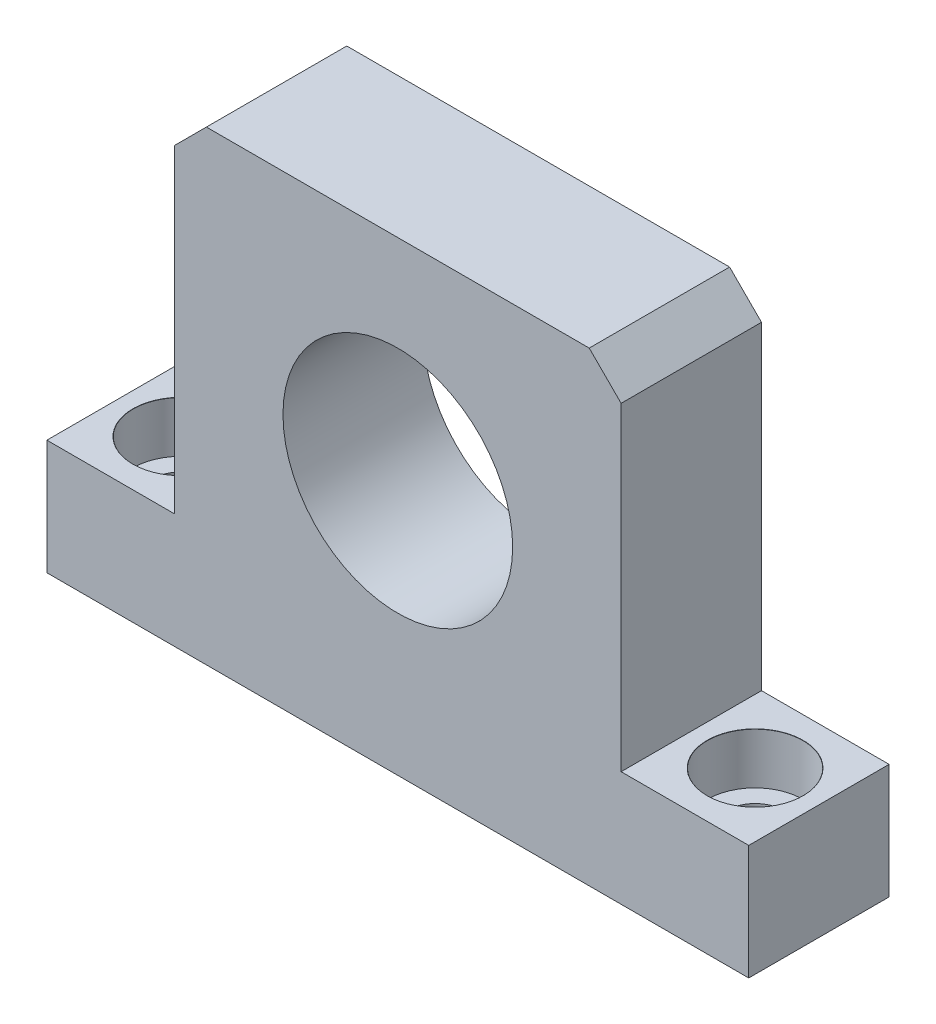
ISO-10303-21;
HEADER;
FILE_DESCRIPTION(('STEP AP214'),'2;1');
FILE_NAME('part.step','',(''),(''),'','','');
FILE_SCHEMA(('AUTOMOTIVE_DESIGN { 1 0 10303 214 1 1 1 1 }'));
ENDSEC;
DATA;
#1=APPLICATION_CONTEXT('core data for automotive mechanical design processes');
#2=APPLICATION_PROTOCOL_DEFINITION('international standard','automotive_design',2000,#1);
#3=PRODUCT_CONTEXT('',#1,'mechanical');
#4=PRODUCT('Part','Part','',(#3));
#5=PRODUCT_RELATED_PRODUCT_CATEGORY('part','',(#4));
#6=PRODUCT_DEFINITION_FORMATION('','',#4);
#7=PRODUCT_DEFINITION_CONTEXT('part definition',#1,'design');
#8=PRODUCT_DEFINITION('design','',#6,#7);
#9=PRODUCT_DEFINITION_SHAPE('','',#8);
#10=(LENGTH_UNIT() NAMED_UNIT(*) SI_UNIT(.MILLI.,.METRE.));
#11=(NAMED_UNIT(*) PLANE_ANGLE_UNIT() SI_UNIT($,.RADIAN.));
#12=(NAMED_UNIT(*) SI_UNIT($,.STERADIAN.) SOLID_ANGLE_UNIT());
#13=UNCERTAINTY_MEASURE_WITH_UNIT(LENGTH_MEASURE(1.E-05),#10,'distance_accuracy_value','');
#14=(GEOMETRIC_REPRESENTATION_CONTEXT(3) GLOBAL_UNCERTAINTY_ASSIGNED_CONTEXT((#13)) GLOBAL_UNIT_ASSIGNED_CONTEXT((#10,
#11,#12)) REPRESENTATION_CONTEXT('',''));
#15=CARTESIAN_POINT('',(0.,0.,0.));
#16=DIRECTION('',(0.,0.,1.));
#17=DIRECTION('',(1.,0.,0.));
#18=AXIS2_PLACEMENT_3D('',#15,#16,#17);
#19=CARTESIAN_POINT('',(-55.,18.,11.));
#20=DIRECTION('',(0.,0.,-1.));
#21=DIRECTION('',(-1.,0.,0.));
#22=AXIS2_PLACEMENT_3D('',#19,#20,#21);
#23=PLANE('',#22);
#24=DIRECTION('',(0.,-1.,0.));
#25=VECTOR('',#24,1.);
#26=CARTESIAN_POINT('',(-55.,0.,11.));
#27=LINE('',#26,#25);
#28=CARTESIAN_POINT('',(-55.,18.,11.));
#29=VERTEX_POINT('',#28);
#30=CARTESIAN_POINT('',(-55.,0.,11.));
#31=VERTEX_POINT('',#30);
#32=EDGE_CURVE('E167',#29,#31,#27,.T.);
#33=ORIENTED_EDGE('',*,*,#32,.T.);
#34=DIRECTION('',(1.,0.,0.));
#35=VECTOR('',#34,1.);
#36=CARTESIAN_POINT('',(-55.,0.,11.));
#37=LINE('',#36,#35);
#38=CARTESIAN_POINT('',(55.,0.,11.));
#39=VERTEX_POINT('',#38);
#40=EDGE_CURVE('E103',#31,#39,#37,.T.);
#41=ORIENTED_EDGE('',*,*,#40,.T.);
#42=DIRECTION('',(0.,1.,0.));
#43=VECTOR('',#42,1.);
#44=CARTESIAN_POINT('',(55.,0.,11.));
#45=LINE('',#44,#43);
#46=CARTESIAN_POINT('',(55.,18.,11.));
#47=VERTEX_POINT('',#46);
#48=EDGE_CURVE('E188',#39,#47,#45,.T.);
#49=ORIENTED_EDGE('',*,*,#48,.T.);
#50=DIRECTION('',(-1.,0.,0.));
#51=VECTOR('',#50,1.);
#52=CARTESIAN_POINT('',(35.,18.,11.));
#53=LINE('',#52,#51);
#54=CARTESIAN_POINT('',(35.,18.,11.));
#55=VERTEX_POINT('',#54);
#56=EDGE_CURVE('E207',#47,#55,#53,.T.);
#57=ORIENTED_EDGE('',*,*,#56,.T.);
#58=DIRECTION('',(0.,1.,0.));
#59=VECTOR('',#58,1.);
#60=CARTESIAN_POINT('',(35.,18.,11.));
#61=LINE('',#60,#59);
#62=CARTESIAN_POINT('',(35.,68.,11.));
#63=VERTEX_POINT('',#62);
#64=EDGE_CURVE('E204',#55,#63,#61,.T.);
#65=ORIENTED_EDGE('',*,*,#64,.T.);
#66=DIRECTION('',(-0.707106781186546,0.707106781186549,0.));
#67=VECTOR('',#66,1.);
#68=CARTESIAN_POINT('',(30.,73.,11.));
#69=LINE('',#68,#67);
#70=CARTESIAN_POINT('',(30.,73.,11.));
#71=VERTEX_POINT('',#70);
#72=EDGE_CURVE('E206',#63,#71,#69,.T.);
#73=ORIENTED_EDGE('',*,*,#72,.T.);
#74=DIRECTION('',(-1.,0.,0.));
#75=VECTOR('',#74,1.);
#76=CARTESIAN_POINT('',(-30.,73.,11.));
#77=LINE('',#76,#75);
#78=CARTESIAN_POINT('',(-30.,73.,11.));
#79=VERTEX_POINT('',#78);
#80=EDGE_CURVE('E130',#71,#79,#77,.T.);
#81=ORIENTED_EDGE('',*,*,#80,.T.);
#82=DIRECTION('',(-0.707106781186547,-0.707106781186548,0.));
#83=VECTOR('',#82,1.);
#84=CARTESIAN_POINT('',(-35.,68.,11.));
#85=LINE('',#84,#83);
#86=CARTESIAN_POINT('',(-35.,68.,11.));
#87=VERTEX_POINT('',#86);
#88=EDGE_CURVE('E124',#79,#87,#85,.T.);
#89=ORIENTED_EDGE('',*,*,#88,.T.);
#90=DIRECTION('',(0.,-1.,0.));
#91=VECTOR('',#90,1.);
#92=CARTESIAN_POINT('',(-35.,18.,11.));
#93=LINE('',#92,#91);
#94=CARTESIAN_POINT('',(-35.,18.,11.));
#95=VERTEX_POINT('',#94);
#96=EDGE_CURVE('E128',#87,#95,#93,.T.);
#97=ORIENTED_EDGE('',*,*,#96,.T.);
#98=DIRECTION('',(-1.,0.,0.));
#99=VECTOR('',#98,1.);
#100=CARTESIAN_POINT('',(-55.,18.,11.));
#101=LINE('',#100,#99);
#102=EDGE_CURVE('E53',#95,#29,#101,.T.);
#103=ORIENTED_EDGE('',*,*,#102,.T.);
#104=EDGE_LOOP('',(#33,#41,#49,#57,#65,#73,#81,#89,#97,#103));
#105=FACE_BOUND('',#104,.T.);
#106=CARTESIAN_POINT('',(0.,40.,11.));
#107=DIRECTION('',(0.,0.,1.));
#108=DIRECTION('',(1.,0.,0.));
#109=AXIS2_PLACEMENT_3D('',#106,#107,#108);
#110=CIRCLE('',#109,18.);
#111=CARTESIAN_POINT('',(18.,40.,11.));
#112=VERTEX_POINT('',#111);
#113=EDGE_CURVE('E152',#112,#112,#110,.T.);
#114=ORIENTED_EDGE('',*,*,#113,.F.);
#115=EDGE_LOOP('',(#114));
#116=FACE_BOUND('',#115,.T.);
#117=ADVANCED_FACE('F36',(#105,#116),#23,.F.);
#118=CARTESIAN_POINT('',(-55.,18.,-11.));
#119=DIRECTION('',(0.,0.,-1.));
#120=DIRECTION('',(-1.,0.,0.));
#121=AXIS2_PLACEMENT_3D('',#118,#119,#120);
#122=PLANE('',#121);
#123=CARTESIAN_POINT('',(-16.6159006878512,25.3829906421212,-11.));
#124=DIRECTION('',(0.,0.,-1.));
#125=DIRECTION('',(-1.,0.,0.));
#126=AXIS2_PLACEMENT_3D('',#123,#124,#125);
#127=CIRCLE('',#126,2.49999999999999);
#128=CARTESIAN_POINT('',(-19.1159006878512,25.3829906421212,-11.));
#129=VERTEX_POINT('',#128);
#130=EDGE_CURVE('E283',#129,#129,#127,.T.);
#131=ORIENTED_EDGE('',*,*,#130,.F.);
#132=EDGE_LOOP('',(#131));
#133=FACE_BOUND('',#132,.T.);
#134=CARTESIAN_POINT('',(16.6181180279163,25.3829906421212,-11.));
#135=DIRECTION('',(0.,0.,-1.));
#136=DIRECTION('',(-1.,0.,0.));
#137=AXIS2_PLACEMENT_3D('',#134,#135,#136);
#138=CIRCLE('',#137,2.49999999999999);
#139=CARTESIAN_POINT('',(14.1181180279163,25.3829906421212,-11.));
#140=VERTEX_POINT('',#139);
#141=EDGE_CURVE('E277',#140,#140,#138,.T.);
#142=ORIENTED_EDGE('',*,*,#141,.F.);
#143=EDGE_LOOP('',(#142));
#144=FACE_BOUND('',#143,.T.);
#145=CARTESIAN_POINT('',(23.5011086700326,42.0000000000052,-11.));
#146=DIRECTION('',(0.,0.,-1.));
#147=DIRECTION('',(-1.,0.,0.));
#148=AXIS2_PLACEMENT_3D('',#145,#146,#147);
#149=CIRCLE('',#148,2.49999999999999);
#150=CARTESIAN_POINT('',(21.0011086700326,42.0000000000052,-11.));
#151=VERTEX_POINT('',#150);
#152=EDGE_CURVE('E271',#151,#151,#149,.T.);
#153=ORIENTED_EDGE('',*,*,#152,.F.);
#154=EDGE_LOOP('',(#153));
#155=FACE_BOUND('',#154,.T.);
#156=CARTESIAN_POINT('',(16.6181180279165,58.617009357889,-11.));
#157=DIRECTION('',(0.,0.,-1.));
#158=DIRECTION('',(-1.,0.,0.));
#159=AXIS2_PLACEMENT_3D('',#156,#157,#158);
#160=CIRCLE('',#159,2.49999999999999);
#161=CARTESIAN_POINT('',(14.1181180279165,58.617009357889,-11.));
#162=VERTEX_POINT('',#161);
#163=EDGE_CURVE('E265',#162,#162,#160,.T.);
#164=ORIENTED_EDGE('',*,*,#163,.F.);
#165=EDGE_LOOP('',(#164));
#166=FACE_BOUND('',#165,.T.);
#167=CARTESIAN_POINT('',(-16.6159006878514,58.617009357889,-11.));
#168=DIRECTION('',(0.,0.,-1.));
#169=DIRECTION('',(-1.,0.,0.));
#170=AXIS2_PLACEMENT_3D('',#167,#168,#169);
#171=CIRCLE('',#170,2.49999999999999);
#172=CARTESIAN_POINT('',(-19.1159006878513,58.617009357889,-11.));
#173=VERTEX_POINT('',#172);
#174=EDGE_CURVE('E259',#173,#173,#171,.T.);
#175=ORIENTED_EDGE('',*,*,#174,.F.);
#176=EDGE_LOOP('',(#175));
#177=FACE_BOUND('',#176,.T.);
#178=CARTESIAN_POINT('',(-23.4988913299675,42.0000000000052,-11.));
#179=DIRECTION('',(0.,0.,-1.));
#180=DIRECTION('',(-1.,0.,0.));
#181=AXIS2_PLACEMENT_3D('',#178,#179,#180);
#182=CIRCLE('',#181,2.49999999999999);
#183=CARTESIAN_POINT('',(-25.9988913299674,42.0000000000052,-11.));
#184=VERTEX_POINT('',#183);
#185=EDGE_CURVE('E253',#184,#184,#182,.T.);
#186=ORIENTED_EDGE('',*,*,#185,.F.);
#187=EDGE_LOOP('',(#186));
#188=FACE_BOUND('',#187,.T.);
#189=DIRECTION('',(0.,-1.,0.));
#190=VECTOR('',#189,1.);
#191=CARTESIAN_POINT('',(-55.,0.,-11.));
#192=LINE('',#191,#190);
#193=CARTESIAN_POINT('',(-55.,18.,-11.));
#194=VERTEX_POINT('',#193);
#195=CARTESIAN_POINT('',(-55.,0.,-11.));
#196=VERTEX_POINT('',#195);
#197=EDGE_CURVE('E148',#194,#196,#192,.T.);
#198=ORIENTED_EDGE('',*,*,#197,.F.);
#199=DIRECTION('',(-1.,0.,0.));
#200=VECTOR('',#199,1.);
#201=CARTESIAN_POINT('',(-55.,18.,-11.));
#202=LINE('',#201,#200);
#203=CARTESIAN_POINT('',(-35.,18.,-11.));
#204=VERTEX_POINT('',#203);
#205=EDGE_CURVE('E95',#204,#194,#202,.T.);
#206=ORIENTED_EDGE('',*,*,#205,.F.);
#207=DIRECTION('',(0.,-1.,0.));
#208=VECTOR('',#207,1.);
#209=CARTESIAN_POINT('',(-35.,18.,-11.));
#210=LINE('',#209,#208);
#211=CARTESIAN_POINT('',(-35.,68.,-11.));
#212=VERTEX_POINT('',#211);
#213=EDGE_CURVE('E89',#212,#204,#210,.T.);
#214=ORIENTED_EDGE('',*,*,#213,.F.);
#215=DIRECTION('',(-0.707106781186547,-0.707106781186548,0.));
#216=VECTOR('',#215,1.);
#217=CARTESIAN_POINT('',(-35.,68.,-11.));
#218=LINE('',#217,#216);
#219=CARTESIAN_POINT('',(-30.,73.,-11.));
#220=VERTEX_POINT('',#219);
#221=EDGE_CURVE('E138',#220,#212,#218,.T.);
#222=ORIENTED_EDGE('',*,*,#221,.F.);
#223=DIRECTION('',(-1.,0.,0.));
#224=VECTOR('',#223,1.);
#225=CARTESIAN_POINT('',(-30.,73.,-11.));
#226=LINE('',#225,#224);
#227=CARTESIAN_POINT('',(30.,73.,-11.));
#228=VERTEX_POINT('',#227);
#229=EDGE_CURVE('E162',#228,#220,#226,.T.);
#230=ORIENTED_EDGE('',*,*,#229,.F.);
#231=DIRECTION('',(-0.707106781186546,0.707106781186549,0.));
#232=VECTOR('',#231,1.);
#233=CARTESIAN_POINT('',(30.,73.,-11.));
#234=LINE('',#233,#232);
#235=CARTESIAN_POINT('',(35.,68.,-11.));
#236=VERTEX_POINT('',#235);
#237=EDGE_CURVE('E160',#236,#228,#234,.T.);
#238=ORIENTED_EDGE('',*,*,#237,.F.);
#239=DIRECTION('',(0.,1.,0.));
#240=VECTOR('',#239,1.);
#241=CARTESIAN_POINT('',(35.,18.,-11.));
#242=LINE('',#241,#240);
#243=CARTESIAN_POINT('',(35.,18.,-11.));
#244=VERTEX_POINT('',#243);
#245=EDGE_CURVE('E158',#244,#236,#242,.T.);
#246=ORIENTED_EDGE('',*,*,#245,.F.);
#247=DIRECTION('',(-1.,0.,0.));
#248=VECTOR('',#247,1.);
#249=CARTESIAN_POINT('',(35.,18.,-11.));
#250=LINE('',#249,#248);
#251=CARTESIAN_POINT('',(55.,18.,-11.));
#252=VERTEX_POINT('',#251);
#253=EDGE_CURVE('E156',#252,#244,#250,.T.);
#254=ORIENTED_EDGE('',*,*,#253,.F.);
#255=DIRECTION('',(0.,1.,0.));
#256=VECTOR('',#255,1.);
#257=CARTESIAN_POINT('',(55.,0.,-11.));
#258=LINE('',#257,#256);
#259=CARTESIAN_POINT('',(55.,0.,-11.));
#260=VERTEX_POINT('',#259);
#261=EDGE_CURVE('E154',#260,#252,#258,.T.);
#262=ORIENTED_EDGE('',*,*,#261,.F.);
#263=DIRECTION('',(1.,0.,0.));
#264=VECTOR('',#263,1.);
#265=CARTESIAN_POINT('',(-55.,0.,-11.));
#266=LINE('',#265,#264);
#267=EDGE_CURVE('E151',#196,#260,#266,.T.);
#268=ORIENTED_EDGE('',*,*,#267,.F.);
#269=EDGE_LOOP('',(#198,#206,#214,#222,#230,#238,#246,#254,#262,#268));
#270=FACE_BOUND('',#269,.T.);
#271=CARTESIAN_POINT('',(0.,40.,-11.));
#272=DIRECTION('',(0.,0.,1.));
#273=DIRECTION('',(1.,0.,0.));
#274=AXIS2_PLACEMENT_3D('',#271,#272,#273);
#275=CIRCLE('',#274,18.);
#276=CARTESIAN_POINT('',(18.,40.,-11.));
#277=VERTEX_POINT('',#276);
#278=EDGE_CURVE('E215',#277,#277,#275,.T.);
#279=ORIENTED_EDGE('',*,*,#278,.T.);
#280=EDGE_LOOP('',(#279));
#281=FACE_BOUND('',#280,.T.);
#282=ADVANCED_FACE('F192',(#133,#144,#155,#166,#177,#188,#270,#281),#122,.T.);
#283=CARTESIAN_POINT('',(-55.,0.,11.));
#284=DIRECTION('',(1.,0.,0.));
#285=DIRECTION('',(0.,0.,-1.));
#286=AXIS2_PLACEMENT_3D('',#283,#284,#285);
#287=PLANE('',#286);
#288=ORIENTED_EDGE('',*,*,#197,.T.);
#289=DIRECTION('',(0.,0.,-1.));
#290=VECTOR('',#289,1.);
#291=CARTESIAN_POINT('',(-55.,0.,11.));
#292=LINE('',#291,#290);
#293=EDGE_CURVE('E11',#31,#196,#292,.T.);
#294=ORIENTED_EDGE('',*,*,#293,.F.);
#295=ORIENTED_EDGE('',*,*,#32,.F.);
#296=DIRECTION('',(0.,0.,-1.));
#297=VECTOR('',#296,1.);
#298=CARTESIAN_POINT('',(-55.,18.,11.));
#299=LINE('',#298,#297);
#300=EDGE_CURVE('E144',#29,#194,#299,.T.);
#301=ORIENTED_EDGE('',*,*,#300,.T.);
#302=EDGE_LOOP('',(#288,#294,#295,#301));
#303=FACE_BOUND('',#302,.T.);
#304=ADVANCED_FACE('F38',(#303),#287,.F.);
#305=CARTESIAN_POINT('',(-55.,0.,11.));
#306=DIRECTION('',(0.,1.,0.));
#307=DIRECTION('',(-1.,0.,0.));
#308=AXIS2_PLACEMENT_3D('',#305,#306,#307);
#309=PLANE('',#308);
#310=CARTESIAN_POINT('',(-45.,0.,0.));
#311=DIRECTION('',(0.,1.,0.));
#312=DIRECTION('',(0.,0.,1.));
#313=AXIS2_PLACEMENT_3D('',#310,#311,#312);
#314=CIRCLE('',#313,4.5);
#315=CARTESIAN_POINT('',(-45.,0.,4.5));
#316=VERTEX_POINT('',#315);
#317=EDGE_CURVE('E235',#316,#316,#314,.T.);
#318=ORIENTED_EDGE('',*,*,#317,.T.);
#319=EDGE_LOOP('',(#318));
#320=FACE_BOUND('',#319,.T.);
#321=CARTESIAN_POINT('',(45.,0.,0.));
#322=DIRECTION('',(0.,1.,0.));
#323=DIRECTION('',(0.,0.,1.));
#324=AXIS2_PLACEMENT_3D('',#321,#322,#323);
#325=CIRCLE('',#324,4.5);
#326=CARTESIAN_POINT('',(45.,0.,4.5));
#327=VERTEX_POINT('',#326);
#328=EDGE_CURVE('E218',#327,#327,#325,.T.);
#329=ORIENTED_EDGE('',*,*,#328,.T.);
#330=EDGE_LOOP('',(#329));
#331=FACE_BOUND('',#330,.T.);
#332=ORIENTED_EDGE('',*,*,#267,.T.);
#333=DIRECTION('',(0.,0.,-1.));
#334=VECTOR('',#333,1.);
#335=CARTESIAN_POINT('',(55.,0.,11.));
#336=LINE('',#335,#334);
#337=EDGE_CURVE('E45',#39,#260,#336,.T.);
#338=ORIENTED_EDGE('',*,*,#337,.F.);
#339=ORIENTED_EDGE('',*,*,#40,.F.);
#340=ORIENTED_EDGE('',*,*,#293,.T.);
#341=EDGE_LOOP('',(#332,#338,#339,#340));
#342=FACE_BOUND('',#341,.T.);
#343=ADVANCED_FACE('F349',(#320,#331,#342),#309,.F.);
#344=CARTESIAN_POINT('',(55.,0.,11.));
#345=DIRECTION('',(-1.,0.,0.));
#346=DIRECTION('',(0.,0.,1.));
#347=AXIS2_PLACEMENT_3D('',#344,#345,#346);
#348=PLANE('',#347);
#349=ORIENTED_EDGE('',*,*,#261,.T.);
#350=DIRECTION('',(0.,0.,-1.));
#351=VECTOR('',#350,1.);
#352=CARTESIAN_POINT('',(55.,18.,11.));
#353=LINE('',#352,#351);
#354=EDGE_CURVE('E180',#47,#252,#353,.T.);
#355=ORIENTED_EDGE('',*,*,#354,.F.);
#356=ORIENTED_EDGE('',*,*,#48,.F.);
#357=ORIENTED_EDGE('',*,*,#337,.T.);
#358=EDGE_LOOP('',(#349,#355,#356,#357));
#359=FACE_BOUND('',#358,.T.);
#360=ADVANCED_FACE('F186',(#359),#348,.F.);
#361=CARTESIAN_POINT('',(35.,18.,11.));
#362=DIRECTION('',(0.,-1.,0.));
#363=DIRECTION('',(1.,0.,0.));
#364=AXIS2_PLACEMENT_3D('',#361,#362,#363);
#365=PLANE('',#364);
#366=CARTESIAN_POINT('',(45.,18.,0.));
#367=DIRECTION('',(0.,1.,0.));
#368=DIRECTION('',(0.,0.,1.));
#369=AXIS2_PLACEMENT_3D('',#366,#367,#368);
#370=CIRCLE('',#369,7.525);
#371=CARTESIAN_POINT('',(45.,18.,7.52500000000001));
#372=VERTEX_POINT('',#371);
#373=EDGE_CURVE('E232',#372,#372,#370,.T.);
#374=ORIENTED_EDGE('',*,*,#373,.F.);
#375=EDGE_LOOP('',(#374));
#376=FACE_BOUND('',#375,.T.);
#377=ORIENTED_EDGE('',*,*,#253,.T.);
#378=DIRECTION('',(0.,0.,-1.));
#379=VECTOR('',#378,1.);
#380=CARTESIAN_POINT('',(35.,18.,11.));
#381=LINE('',#380,#379);
#382=EDGE_CURVE('E177',#55,#244,#381,.T.);
#383=ORIENTED_EDGE('',*,*,#382,.F.);
#384=ORIENTED_EDGE('',*,*,#56,.F.);
#385=ORIENTED_EDGE('',*,*,#354,.T.);
#386=EDGE_LOOP('',(#377,#383,#384,#385));
#387=FACE_BOUND('',#386,.T.);
#388=ADVANCED_FACE('F198',(#376,#387),#365,.F.);
#389=CARTESIAN_POINT('',(35.,18.,11.));
#390=DIRECTION('',(-1.,0.,0.));
#391=DIRECTION('',(0.,0.,1.));
#392=AXIS2_PLACEMENT_3D('',#389,#390,#391);
#393=PLANE('',#392);
#394=ORIENTED_EDGE('',*,*,#245,.T.);
#395=DIRECTION('',(0.,0.,-1.));
#396=VECTOR('',#395,1.);
#397=CARTESIAN_POINT('',(35.,68.,11.));
#398=LINE('',#397,#396);
#399=EDGE_CURVE('E174',#63,#236,#398,.T.);
#400=ORIENTED_EDGE('',*,*,#399,.F.);
#401=ORIENTED_EDGE('',*,*,#64,.F.);
#402=ORIENTED_EDGE('',*,*,#382,.T.);
#403=EDGE_LOOP('',(#394,#400,#401,#402));
#404=FACE_BOUND('',#403,.T.);
#405=ADVANCED_FACE('F202',(#404),#393,.F.);
#406=CARTESIAN_POINT('',(30.,73.,11.));
#407=DIRECTION('',(-0.707106781186549,-0.707106781186546,0.));
#408=DIRECTION('',(0.707106781186546,-0.707106781186549,0.));
#409=AXIS2_PLACEMENT_3D('',#406,#407,#408);
#410=PLANE('',#409);
#411=ORIENTED_EDGE('',*,*,#237,.T.);
#412=DIRECTION('',(0.,0.,-1.));
#413=VECTOR('',#412,1.);
#414=CARTESIAN_POINT('',(30.,73.,11.));
#415=LINE('',#414,#413);
#416=EDGE_CURVE('E171',#71,#228,#415,.T.);
#417=ORIENTED_EDGE('',*,*,#416,.F.);
#418=ORIENTED_EDGE('',*,*,#72,.F.);
#419=ORIENTED_EDGE('',*,*,#399,.T.);
#420=EDGE_LOOP('',(#411,#417,#418,#419));
#421=FACE_BOUND('',#420,.T.);
#422=ADVANCED_FACE('F338',(#421),#410,.F.);
#423=CARTESIAN_POINT('',(-30.,73.,11.));
#424=DIRECTION('',(0.,-1.,0.));
#425=DIRECTION('',(1.,0.,0.));
#426=AXIS2_PLACEMENT_3D('',#423,#424,#425);
#427=PLANE('',#426);
#428=ORIENTED_EDGE('',*,*,#229,.T.);
#429=DIRECTION('',(0.,0.,-1.));
#430=VECTOR('',#429,1.);
#431=CARTESIAN_POINT('',(-30.,73.,11.));
#432=LINE('',#431,#430);
#433=EDGE_CURVE('E139',#79,#220,#432,.T.);
#434=ORIENTED_EDGE('',*,*,#433,.F.);
#435=ORIENTED_EDGE('',*,*,#80,.F.);
#436=ORIENTED_EDGE('',*,*,#416,.T.);
#437=EDGE_LOOP('',(#428,#434,#435,#436));
#438=FACE_BOUND('',#437,.T.);
#439=ADVANCED_FACE('F335',(#438),#427,.F.);
#440=CARTESIAN_POINT('',(-35.,68.,11.));
#441=DIRECTION('',(0.707106781186548,-0.707106781186547,0.));
#442=DIRECTION('',(0.707106781186547,0.707106781186548,0.));
#443=AXIS2_PLACEMENT_3D('',#440,#441,#442);
#444=PLANE('',#443);
#445=ORIENTED_EDGE('',*,*,#221,.T.);
#446=DIRECTION('',(0.,0.,-1.));
#447=VECTOR('',#446,1.);
#448=CARTESIAN_POINT('',(-35.,68.,11.));
#449=LINE('',#448,#447);
#450=EDGE_CURVE('E135',#87,#212,#449,.T.);
#451=ORIENTED_EDGE('',*,*,#450,.F.);
#452=ORIENTED_EDGE('',*,*,#88,.F.);
#453=ORIENTED_EDGE('',*,*,#433,.T.);
#454=EDGE_LOOP('',(#445,#451,#452,#453));
#455=FACE_BOUND('',#454,.T.);
#456=ADVANCED_FACE('F136',(#455),#444,.F.);
#457=CARTESIAN_POINT('',(-35.,18.,11.));
#458=DIRECTION('',(1.,0.,0.));
#459=DIRECTION('',(0.,0.,-1.));
#460=AXIS2_PLACEMENT_3D('',#457,#458,#459);
#461=PLANE('',#460);
#462=ORIENTED_EDGE('',*,*,#213,.T.);
#463=DIRECTION('',(0.,0.,-1.));
#464=VECTOR('',#463,1.);
#465=CARTESIAN_POINT('',(-35.,18.,11.));
#466=LINE('',#465,#464);
#467=EDGE_CURVE('E140',#95,#204,#466,.T.);
#468=ORIENTED_EDGE('',*,*,#467,.F.);
#469=ORIENTED_EDGE('',*,*,#96,.F.);
#470=ORIENTED_EDGE('',*,*,#450,.T.);
#471=EDGE_LOOP('',(#462,#468,#469,#470));
#472=FACE_BOUND('',#471,.T.);
#473=ADVANCED_FACE('F142',(#472),#461,.F.);
#474=CARTESIAN_POINT('',(-55.,18.,11.));
#475=DIRECTION('',(0.,-1.,0.));
#476=DIRECTION('',(0.,0.,-1.));
#477=AXIS2_PLACEMENT_3D('',#474,#475,#476);
#478=PLANE('',#477);
#479=CARTESIAN_POINT('',(-45.,18.,0.));
#480=DIRECTION('',(0.,1.,0.));
#481=DIRECTION('',(0.,0.,1.));
#482=AXIS2_PLACEMENT_3D('',#479,#480,#481);
#483=CIRCLE('',#482,7.525);
#484=CARTESIAN_POINT('',(-45.,18.,7.52500000000001));
#485=VERTEX_POINT('',#484);
#486=EDGE_CURVE('E247',#485,#485,#483,.T.);
#487=ORIENTED_EDGE('',*,*,#486,.F.);
#488=EDGE_LOOP('',(#487));
#489=FACE_BOUND('',#488,.T.);
#490=ORIENTED_EDGE('',*,*,#205,.T.);
#491=ORIENTED_EDGE('',*,*,#300,.F.);
#492=ORIENTED_EDGE('',*,*,#102,.F.);
#493=ORIENTED_EDGE('',*,*,#467,.T.);
#494=EDGE_LOOP('',(#490,#491,#492,#493));
#495=FACE_BOUND('',#494,.T.);
#496=ADVANCED_FACE('F327',(#489,#495),#478,.F.);
#497=CARTESIAN_POINT('',(0.,40.,11.));
#498=DIRECTION('',(0.,0.,-1.));
#499=DIRECTION('',(-1.,0.,0.));
#500=AXIS2_PLACEMENT_3D('',#497,#498,#499);
#501=CYLINDRICAL_SURFACE('',#500,18.);
#502=ORIENTED_EDGE('',*,*,#113,.T.);
#503=EDGE_LOOP('',(#502));
#504=FACE_BOUND('',#503,.T.);
#505=ORIENTED_EDGE('',*,*,#278,.F.);
#506=EDGE_LOOP('',(#505));
#507=FACE_BOUND('',#506,.T.);
#508=ADVANCED_FACE('F324',(#504,#507),#501,.F.);
#509=CARTESIAN_POINT('',(45.,18.,0.));
#510=DIRECTION('',(0.,1.,0.));
#511=DIRECTION('',(0.,0.,1.));
#512=AXIS2_PLACEMENT_3D('',#509,#510,#511);
#513=CYLINDRICAL_SURFACE('',#512,4.5);
#514=ORIENTED_EDGE('',*,*,#328,.F.);
#515=EDGE_LOOP('',(#514));
#516=FACE_BOUND('',#515,.T.);
#517=CARTESIAN_POINT('',(45.,10.,0.));
#518=DIRECTION('',(0.,1.,0.));
#519=DIRECTION('',(0.,0.,1.));
#520=AXIS2_PLACEMENT_3D('',#517,#518,#519);
#521=CIRCLE('',#520,4.5);
#522=CARTESIAN_POINT('',(45.,10.,4.5));
#523=VERTEX_POINT('',#522);
#524=EDGE_CURVE('E223',#523,#523,#521,.T.);
#525=ORIENTED_EDGE('',*,*,#524,.T.);
#526=EDGE_LOOP('',(#525));
#527=FACE_BOUND('',#526,.T.);
#528=ADVANCED_FACE('F364',(#516,#527),#513,.F.);
#529=CARTESIAN_POINT('',(52.5,10.,0.));
#530=DIRECTION('',(0.,-1.,0.));
#531=DIRECTION('',(0.,0.,-1.));
#532=AXIS2_PLACEMENT_3D('',#529,#530,#531);
#533=PLANE('',#532);
#534=ORIENTED_EDGE('',*,*,#524,.F.);
#535=EDGE_LOOP('',(#534));
#536=FACE_BOUND('',#535,.T.);
#537=CARTESIAN_POINT('',(45.,10.,0.));
#538=DIRECTION('',(0.,1.,0.));
#539=DIRECTION('',(0.,0.,1.));
#540=AXIS2_PLACEMENT_3D('',#537,#538,#539);
#541=CIRCLE('',#540,7.5);
#542=CARTESIAN_POINT('',(45.,10.,7.5));
#543=VERTEX_POINT('',#542);
#544=EDGE_CURVE('E226',#543,#543,#541,.T.);
#545=ORIENTED_EDGE('',*,*,#544,.T.);
#546=EDGE_LOOP('',(#545));
#547=FACE_BOUND('',#546,.T.);
#548=ADVANCED_FACE('F367',(#536,#547),#533,.F.);
#549=CARTESIAN_POINT('',(45.,18.,0.));
#550=DIRECTION('',(0.,1.,0.));
#551=DIRECTION('',(0.,0.,1.));
#552=AXIS2_PLACEMENT_3D('',#549,#550,#551);
#553=CYLINDRICAL_SURFACE('',#552,7.5);
#554=ORIENTED_EDGE('',*,*,#544,.F.);
#555=EDGE_LOOP('',(#554));
#556=FACE_BOUND('',#555,.T.);
#557=CARTESIAN_POINT('',(45.,17.975,0.));
#558=DIRECTION('',(0.,1.,0.));
#559=DIRECTION('',(0.,0.,1.));
#560=AXIS2_PLACEMENT_3D('',#557,#558,#559);
#561=CIRCLE('',#560,7.49999999999999);
#562=CARTESIAN_POINT('',(45.,17.975,7.49999999999999));
#563=VERTEX_POINT('',#562);
#564=EDGE_CURVE('E229',#563,#563,#561,.T.);
#565=ORIENTED_EDGE('',*,*,#564,.T.);
#566=EDGE_LOOP('',(#565));
#567=FACE_BOUND('',#566,.T.);
#568=ADVANCED_FACE('F372',(#556,#567),#553,.F.);
#569=CARTESIAN_POINT('',(45.,18.,0.));
#570=DIRECTION('',(0.,1.,0.));
#571=DIRECTION('',(0.,0.,1.));
#572=AXIS2_PLACEMENT_3D('',#569,#570,#571);
#573=CONICAL_SURFACE('',#572,7.525,0.785398163397587);
#574=ORIENTED_EDGE('',*,*,#564,.F.);
#575=EDGE_LOOP('',(#574));
#576=FACE_BOUND('',#575,.T.);
#577=ORIENTED_EDGE('',*,*,#373,.T.);
#578=EDGE_LOOP('',(#577));
#579=FACE_BOUND('',#578,.T.);
#580=ADVANCED_FACE('F378',(#576,#579),#573,.F.);
#581=CARTESIAN_POINT('',(-45.,18.,0.));
#582=DIRECTION('',(0.,1.,0.));
#583=DIRECTION('',(0.,0.,1.));
#584=AXIS2_PLACEMENT_3D('',#581,#582,#583);
#585=CYLINDRICAL_SURFACE('',#584,4.5);
#586=ORIENTED_EDGE('',*,*,#317,.F.);
#587=EDGE_LOOP('',(#586));
#588=FACE_BOUND('',#587,.T.);
#589=CARTESIAN_POINT('',(-45.,9.99999999999999,0.));
#590=DIRECTION('',(0.,1.,0.));
#591=DIRECTION('',(0.,0.,1.));
#592=AXIS2_PLACEMENT_3D('',#589,#590,#591);
#593=CIRCLE('',#592,4.5);
#594=CARTESIAN_POINT('',(-45.,9.99999999999999,4.5));
#595=VERTEX_POINT('',#594);
#596=EDGE_CURVE('E238',#595,#595,#593,.T.);
#597=ORIENTED_EDGE('',*,*,#596,.T.);
#598=EDGE_LOOP('',(#597));
#599=FACE_BOUND('',#598,.T.);
#600=ADVANCED_FACE('F384',(#588,#599),#585,.F.);
#601=CARTESIAN_POINT('',(-37.5,9.99999999999999,0.));
#602=DIRECTION('',(0.,-1.,0.));
#603=DIRECTION('',(0.,0.,-1.));
#604=AXIS2_PLACEMENT_3D('',#601,#602,#603);
#605=PLANE('',#604);
#606=ORIENTED_EDGE('',*,*,#596,.F.);
#607=EDGE_LOOP('',(#606));
#608=FACE_BOUND('',#607,.T.);
#609=CARTESIAN_POINT('',(-45.,9.99999999999999,0.));
#610=DIRECTION('',(0.,1.,0.));
#611=DIRECTION('',(0.,0.,1.));
#612=AXIS2_PLACEMENT_3D('',#609,#610,#611);
#613=CIRCLE('',#612,7.5);
#614=CARTESIAN_POINT('',(-45.,9.99999999999999,7.5));
#615=VERTEX_POINT('',#614);
#616=EDGE_CURVE('E241',#615,#615,#613,.T.);
#617=ORIENTED_EDGE('',*,*,#616,.T.);
#618=EDGE_LOOP('',(#617));
#619=FACE_BOUND('',#618,.T.);
#620=ADVANCED_FACE('F390',(#608,#619),#605,.F.);
#621=CARTESIAN_POINT('',(-45.,18.,0.));
#622=DIRECTION('',(0.,1.,0.));
#623=DIRECTION('',(0.,0.,1.));
#624=AXIS2_PLACEMENT_3D('',#621,#622,#623);
#625=CYLINDRICAL_SURFACE('',#624,7.5);
#626=ORIENTED_EDGE('',*,*,#616,.F.);
#627=EDGE_LOOP('',(#626));
#628=FACE_BOUND('',#627,.T.);
#629=CARTESIAN_POINT('',(-45.,17.975,0.));
#630=DIRECTION('',(0.,1.,0.));
#631=DIRECTION('',(0.,0.,1.));
#632=AXIS2_PLACEMENT_3D('',#629,#630,#631);
#633=CIRCLE('',#632,7.49999999999999);
#634=CARTESIAN_POINT('',(-45.,17.975,7.49999999999999));
#635=VERTEX_POINT('',#634);
#636=EDGE_CURVE('E244',#635,#635,#633,.T.);
#637=ORIENTED_EDGE('',*,*,#636,.T.);
#638=EDGE_LOOP('',(#637));
#639=FACE_BOUND('',#638,.T.);
#640=ADVANCED_FACE('F396',(#628,#639),#625,.F.);
#641=CARTESIAN_POINT('',(-45.,18.,0.));
#642=DIRECTION('',(0.,1.,0.));
#643=DIRECTION('',(0.,0.,1.));
#644=AXIS2_PLACEMENT_3D('',#641,#642,#643);
#645=CONICAL_SURFACE('',#644,7.525,0.785398163397587);
#646=ORIENTED_EDGE('',*,*,#636,.F.);
#647=EDGE_LOOP('',(#646));
#648=FACE_BOUND('',#647,.T.);
#649=ORIENTED_EDGE('',*,*,#486,.T.);
#650=EDGE_LOOP('',(#649));
#651=FACE_BOUND('',#650,.T.);
#652=ADVANCED_FACE('F315',(#648,#651),#645,.F.);
#653=CARTESIAN_POINT('',(-23.4988913299675,42.0000000000052,4.));
#654=DIRECTION('',(0.,0.,-1.));
#655=DIRECTION('',(-1.,0.,0.));
#656=AXIS2_PLACEMENT_3D('',#653,#654,#655);
#657=CONICAL_SURFACE('',#656,2.49999999999998,1.02974425867665);
#658=CARTESIAN_POINT('',(-23.4988913299675,42.0000000000052,5.5021515475689));
#659=VERTEX_POINT('',#658);
#660=VERTEX_LOOP('',#659);
#661=FACE_BOUND('',#660,.T.);
#662=CARTESIAN_POINT('',(-23.4988913299675,42.0000000000052,4.));
#663=DIRECTION('',(0.,0.,-1.));
#664=DIRECTION('',(-1.,0.,0.));
#665=AXIS2_PLACEMENT_3D('',#662,#663,#664);
#666=CIRCLE('',#665,2.49999999999998);
#667=CARTESIAN_POINT('',(-25.9988913299674,42.0000000000052,4.));
#668=VERTEX_POINT('',#667);
#669=EDGE_CURVE('E250',#668,#668,#666,.T.);
#670=ORIENTED_EDGE('',*,*,#669,.T.);
#671=EDGE_LOOP('',(#670));
#672=FACE_BOUND('',#671,.T.);
#673=ADVANCED_FACE('F305',(#661,#672),#657,.F.);
#674=CARTESIAN_POINT('',(-23.4988913299675,42.0000000000052,-11.));
#675=DIRECTION('',(0.,0.,-1.));
#676=DIRECTION('',(-1.,0.,0.));
#677=AXIS2_PLACEMENT_3D('',#674,#675,#676);
#678=CYLINDRICAL_SURFACE('',#677,2.49999999999999);
#679=ORIENTED_EDGE('',*,*,#669,.F.);
#680=EDGE_LOOP('',(#679));
#681=FACE_BOUND('',#680,.T.);
#682=ORIENTED_EDGE('',*,*,#185,.T.);
#683=EDGE_LOOP('',(#682));
#684=FACE_BOUND('',#683,.T.);
#685=ADVANCED_FACE('F302',(#681,#684),#678,.F.);
#686=CARTESIAN_POINT('',(-16.6159006878514,58.617009357889,4.));
#687=DIRECTION('',(0.,0.,-1.));
#688=DIRECTION('',(-1.,0.,0.));
#689=AXIS2_PLACEMENT_3D('',#686,#687,#688);
#690=CONICAL_SURFACE('',#689,2.49999999999999,1.02974425867665);
#691=CARTESIAN_POINT('',(-16.6159006878514,58.617009357889,5.5021515475689));
#692=VERTEX_POINT('',#691);
#693=VERTEX_LOOP('',#692);
#694=FACE_BOUND('',#693,.T.);
#695=CARTESIAN_POINT('',(-16.6159006878514,58.617009357889,4.));
#696=DIRECTION('',(0.,0.,-1.));
#697=DIRECTION('',(-1.,0.,0.));
#698=AXIS2_PLACEMENT_3D('',#695,#696,#697);
#699=CIRCLE('',#698,2.49999999999999);
#700=CARTESIAN_POINT('',(-19.1159006878513,58.617009357889,4.));
#701=VERTEX_POINT('',#700);
#702=EDGE_CURVE('E256',#701,#701,#699,.T.);
#703=ORIENTED_EDGE('',*,*,#702,.T.);
#704=EDGE_LOOP('',(#703));
#705=FACE_BOUND('',#704,.T.);
#706=ADVANCED_FACE('F304',(#694,#705),#690,.F.);
#707=CARTESIAN_POINT('',(-16.6159006878514,58.617009357889,-11.));
#708=DIRECTION('',(0.,0.,-1.));
#709=DIRECTION('',(-1.,0.,0.));
#710=AXIS2_PLACEMENT_3D('',#707,#708,#709);
#711=CYLINDRICAL_SURFACE('',#710,2.49999999999999);
#712=ORIENTED_EDGE('',*,*,#702,.F.);
#713=EDGE_LOOP('',(#712));
#714=FACE_BOUND('',#713,.T.);
#715=ORIENTED_EDGE('',*,*,#174,.T.);
#716=EDGE_LOOP('',(#715));
#717=FACE_BOUND('',#716,.T.);
#718=ADVANCED_FACE('F312',(#714,#717),#711,.F.);
#719=CARTESIAN_POINT('',(16.6181180279165,58.617009357889,4.));
#720=DIRECTION('',(0.,0.,-1.));
#721=DIRECTION('',(-1.,0.,0.));
#722=AXIS2_PLACEMENT_3D('',#719,#720,#721);
#723=CONICAL_SURFACE('',#722,2.49999999999999,1.02974425867665);
#724=CARTESIAN_POINT('',(16.6181180279165,58.617009357889,5.5021515475689));
#725=VERTEX_POINT('',#724);
#726=VERTEX_LOOP('',#725);
#727=FACE_BOUND('',#726,.T.);
#728=CARTESIAN_POINT('',(16.6181180279165,58.617009357889,4.));
#729=DIRECTION('',(0.,0.,-1.));
#730=DIRECTION('',(-1.,0.,0.));
#731=AXIS2_PLACEMENT_3D('',#728,#729,#730);
#732=CIRCLE('',#731,2.49999999999999);
#733=CARTESIAN_POINT('',(14.1181180279165,58.617009357889,4.));
#734=VERTEX_POINT('',#733);
#735=EDGE_CURVE('E262',#734,#734,#732,.T.);
#736=ORIENTED_EDGE('',*,*,#735,.T.);
#737=EDGE_LOOP('',(#736));
#738=FACE_BOUND('',#737,.T.);
#739=ADVANCED_FACE('F430',(#727,#738),#723,.F.);
#740=CARTESIAN_POINT('',(16.6181180279165,58.617009357889,-11.));
#741=DIRECTION('',(0.,0.,-1.));
#742=DIRECTION('',(-1.,0.,0.));
#743=AXIS2_PLACEMENT_3D('',#740,#741,#742);
#744=CYLINDRICAL_SURFACE('',#743,2.49999999999999);
#745=ORIENTED_EDGE('',*,*,#735,.F.);
#746=EDGE_LOOP('',(#745));
#747=FACE_BOUND('',#746,.T.);
#748=ORIENTED_EDGE('',*,*,#163,.T.);
#749=EDGE_LOOP('',(#748));
#750=FACE_BOUND('',#749,.T.);
#751=ADVANCED_FACE('F435',(#747,#750),#744,.F.);
#752=CARTESIAN_POINT('',(23.5011086700326,42.0000000000052,4.));
#753=DIRECTION('',(0.,0.,-1.));
#754=DIRECTION('',(-1.,0.,0.));
#755=AXIS2_PLACEMENT_3D('',#752,#753,#754);
#756=CONICAL_SURFACE('',#755,2.49999999999999,1.02974425867665);
#757=CARTESIAN_POINT('',(23.5011086700326,42.0000000000052,5.5021515475689));
#758=VERTEX_POINT('',#757);
#759=VERTEX_LOOP('',#758);
#760=FACE_BOUND('',#759,.T.);
#761=CARTESIAN_POINT('',(23.5011086700326,42.0000000000052,4.));
#762=DIRECTION('',(0.,0.,-1.));
#763=DIRECTION('',(-1.,0.,0.));
#764=AXIS2_PLACEMENT_3D('',#761,#762,#763);
#765=CIRCLE('',#764,2.49999999999999);
#766=CARTESIAN_POINT('',(21.0011086700326,42.0000000000052,4.));
#767=VERTEX_POINT('',#766);
#768=EDGE_CURVE('E268',#767,#767,#765,.T.);
#769=ORIENTED_EDGE('',*,*,#768,.T.);
#770=EDGE_LOOP('',(#769));
#771=FACE_BOUND('',#770,.T.);
#772=ADVANCED_FACE('F443',(#760,#771),#756,.F.);
#773=CARTESIAN_POINT('',(23.5011086700326,42.0000000000052,-11.));
#774=DIRECTION('',(0.,0.,-1.));
#775=DIRECTION('',(-1.,0.,0.));
#776=AXIS2_PLACEMENT_3D('',#773,#774,#775);
#777=CYLINDRICAL_SURFACE('',#776,2.49999999999999);
#778=ORIENTED_EDGE('',*,*,#768,.F.);
#779=EDGE_LOOP('',(#778));
#780=FACE_BOUND('',#779,.T.);
#781=ORIENTED_EDGE('',*,*,#152,.T.);
#782=EDGE_LOOP('',(#781));
#783=FACE_BOUND('',#782,.T.);
#784=ADVANCED_FACE('F448',(#780,#783),#777,.F.);
#785=CARTESIAN_POINT('',(16.6181180279163,25.3829906421212,4.));
#786=DIRECTION('',(0.,0.,-1.));
#787=DIRECTION('',(-1.,0.,0.));
#788=AXIS2_PLACEMENT_3D('',#785,#786,#787);
#789=CONICAL_SURFACE('',#788,2.49999999999998,1.02974425867665);
#790=CARTESIAN_POINT('',(16.6181180279163,25.3829906421212,5.5021515475689));
#791=VERTEX_POINT('',#790);
#792=VERTEX_LOOP('',#791);
#793=FACE_BOUND('',#792,.T.);
#794=CARTESIAN_POINT('',(16.6181180279163,25.3829906421212,4.));
#795=DIRECTION('',(0.,0.,-1.));
#796=DIRECTION('',(-1.,0.,0.));
#797=AXIS2_PLACEMENT_3D('',#794,#795,#796);
#798=CIRCLE('',#797,2.49999999999998);
#799=CARTESIAN_POINT('',(14.1181180279163,25.3829906421212,4.));
#800=VERTEX_POINT('',#799);
#801=EDGE_CURVE('E274',#800,#800,#798,.T.);
#802=ORIENTED_EDGE('',*,*,#801,.T.);
#803=EDGE_LOOP('',(#802));
#804=FACE_BOUND('',#803,.T.);
#805=ADVANCED_FACE('F456',(#793,#804),#789,.F.);
#806=CARTESIAN_POINT('',(16.6181180279163,25.3829906421212,-11.));
#807=DIRECTION('',(0.,0.,-1.));
#808=DIRECTION('',(-1.,0.,0.));
#809=AXIS2_PLACEMENT_3D('',#806,#807,#808);
#810=CYLINDRICAL_SURFACE('',#809,2.49999999999999);
#811=ORIENTED_EDGE('',*,*,#801,.F.);
#812=EDGE_LOOP('',(#811));
#813=FACE_BOUND('',#812,.T.);
#814=ORIENTED_EDGE('',*,*,#141,.T.);
#815=EDGE_LOOP('',(#814));
#816=FACE_BOUND('',#815,.T.);
#817=ADVANCED_FACE('F461',(#813,#816),#810,.F.);
#818=CARTESIAN_POINT('',(-16.6159006878512,25.3829906421212,4.));
#819=DIRECTION('',(0.,0.,-1.));
#820=DIRECTION('',(-1.,0.,0.));
#821=AXIS2_PLACEMENT_3D('',#818,#819,#820);
#822=CONICAL_SURFACE('',#821,2.49999999999999,1.02974425867665);
#823=CARTESIAN_POINT('',(-16.6159006878512,25.3829906421212,5.5021515475689));
#824=VERTEX_POINT('',#823);
#825=VERTEX_LOOP('',#824);
#826=FACE_BOUND('',#825,.T.);
#827=CARTESIAN_POINT('',(-16.6159006878512,25.3829906421212,4.));
#828=DIRECTION('',(0.,0.,-1.));
#829=DIRECTION('',(-1.,0.,0.));
#830=AXIS2_PLACEMENT_3D('',#827,#828,#829);
#831=CIRCLE('',#830,2.49999999999999);
#832=CARTESIAN_POINT('',(-19.1159006878512,25.3829906421212,4.));
#833=VERTEX_POINT('',#832);
#834=EDGE_CURVE('E280',#833,#833,#831,.T.);
#835=ORIENTED_EDGE('',*,*,#834,.T.);
#836=EDGE_LOOP('',(#835));
#837=FACE_BOUND('',#836,.T.);
#838=ADVANCED_FACE('F469',(#826,#837),#822,.F.);
#839=CARTESIAN_POINT('',(-16.6159006878512,25.3829906421212,-11.));
#840=DIRECTION('',(0.,0.,-1.));
#841=DIRECTION('',(-1.,0.,0.));
#842=AXIS2_PLACEMENT_3D('',#839,#840,#841);
#843=CYLINDRICAL_SURFACE('',#842,2.49999999999999);
#844=ORIENTED_EDGE('',*,*,#834,.F.);
#845=EDGE_LOOP('',(#844));
#846=FACE_BOUND('',#845,.T.);
#847=ORIENTED_EDGE('',*,*,#130,.T.);
#848=EDGE_LOOP('',(#847));
#849=FACE_BOUND('',#848,.T.);
#850=ADVANCED_FACE('F287',(#846,#849),#843,.F.);
#851=CLOSED_SHELL('',(#117,#282,#304,#343,#360,#388,#405,#422,#439,#456,#473,#496,#508,#528,
#548,#568,#580,#600,#620,#640,#652,#673,#685,#706,#718,#739,#751,#772,#784,#805,#817,#838,#850));
#852=MANIFOLD_SOLID_BREP('B2',#851);
#853=ADVANCED_BREP_SHAPE_REPRESENTATION('',(#18,#852),#14);
#854=SHAPE_DEFINITION_REPRESENTATION(#9,#853);
ENDSEC;
END-ISO-10303-21;
